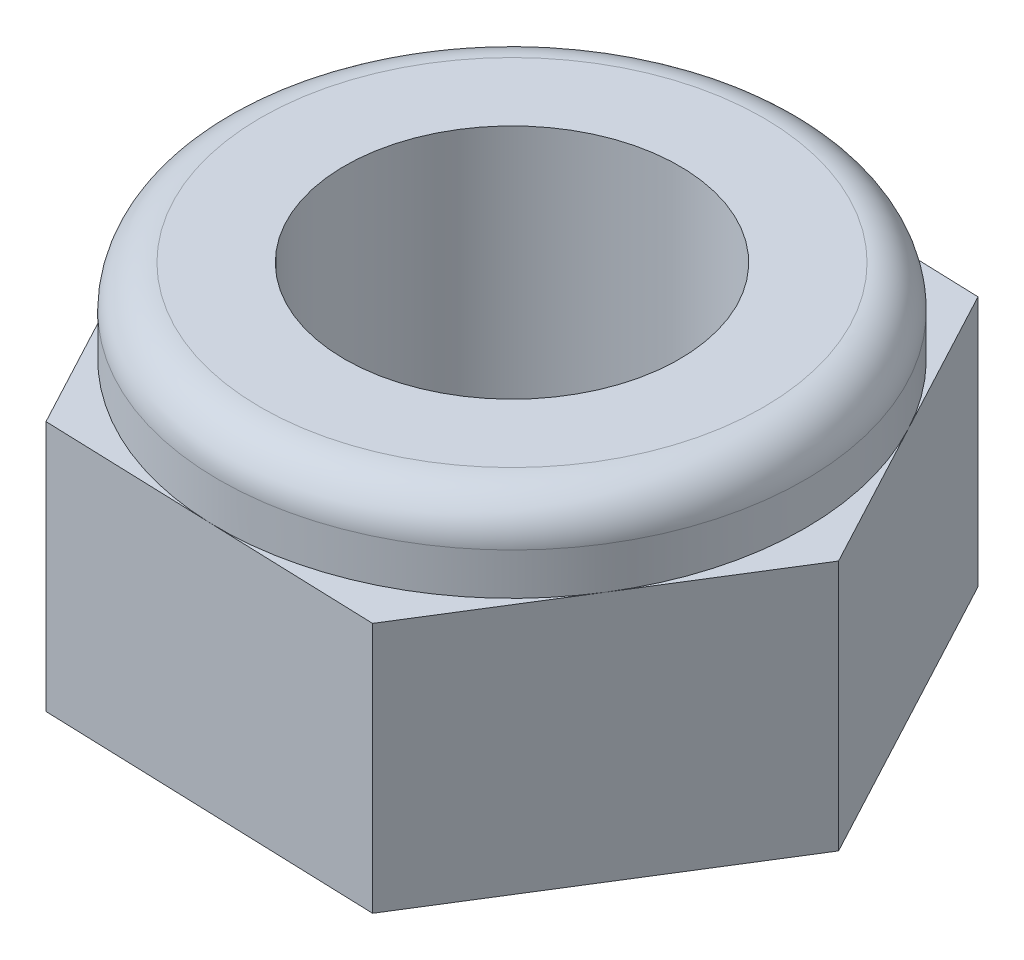
ISO-10303-21;
HEADER;
FILE_DESCRIPTION(('STEP AP214'),'2;1');
FILE_NAME('part.step','',(''),(''),'','','');
FILE_SCHEMA(('AUTOMOTIVE_DESIGN { 1 0 10303 214 1 1 1 1 }'));
ENDSEC;
DATA;
#1=APPLICATION_CONTEXT('core data for automotive mechanical design processes');
#2=APPLICATION_PROTOCOL_DEFINITION('international standard','automotive_design',2000,#1);
#3=PRODUCT_CONTEXT('',#1,'mechanical');
#4=PRODUCT('Part','Part','',(#3));
#5=PRODUCT_RELATED_PRODUCT_CATEGORY('part','',(#4));
#6=PRODUCT_DEFINITION_FORMATION('','',#4);
#7=PRODUCT_DEFINITION_CONTEXT('part definition',#1,'design');
#8=PRODUCT_DEFINITION('design','',#6,#7);
#9=PRODUCT_DEFINITION_SHAPE('','',#8);
#10=(LENGTH_UNIT() NAMED_UNIT(*) SI_UNIT(.MILLI.,.METRE.));
#11=(NAMED_UNIT(*) PLANE_ANGLE_UNIT() SI_UNIT($,.RADIAN.));
#12=(NAMED_UNIT(*) SI_UNIT($,.STERADIAN.) SOLID_ANGLE_UNIT());
#13=UNCERTAINTY_MEASURE_WITH_UNIT(LENGTH_MEASURE(1.E-05),#10,'distance_accuracy_value','');
#14=(GEOMETRIC_REPRESENTATION_CONTEXT(3) GLOBAL_UNCERTAINTY_ASSIGNED_CONTEXT((#13)) GLOBAL_UNIT_ASSIGNED_CONTEXT((#10,
#11,#12)) REPRESENTATION_CONTEXT('',''));
#15=CARTESIAN_POINT('',(0.,0.,0.));
#16=DIRECTION('',(0.,0.,1.));
#17=DIRECTION('',(1.,0.,0.));
#18=AXIS2_PLACEMENT_3D('',#15,#16,#17);
#19=CARTESIAN_POINT('',(0.,3.,0.));
#20=DIRECTION('',(0.,1.,0.));
#21=DIRECTION('',(0.,0.,1.));
#22=AXIS2_PLACEMENT_3D('',#19,#20,#21);
#23=PLANE('',#22);
#24=CARTESIAN_POINT('',(0.,3.,0.));
#25=DIRECTION('',(0.,1.,0.));
#26=DIRECTION('',(0.,0.,1.));
#27=AXIS2_PLACEMENT_3D('',#24,#25,#26);
#28=CIRCLE('',#27,3.5);
#29=CARTESIAN_POINT('',(2.96991913044493,3.,1.85191262175547));
#30=VERTEX_POINT('',#29);
#31=CARTESIAN_POINT('',(3.08876294125175,3.,-1.64606910327296));
#32=VERTEX_POINT('',#31);
#33=EDGE_CURVE('E130',#30,#32,#28,.T.);
#34=ORIENTED_EDGE('',*,*,#33,.F.);
#35=DIRECTION('',(0.529117891930135,0.,-0.848548322984266));
#36=VECTOR('',#35,1.);
#37=CARTESIAN_POINT('',(1.90071687975874,3.,3.56659623118927));
#38=LINE('',#37,#36);
#39=CARTESIAN_POINT('',(4.03912138113112,3.,0.137229012321677));
#40=VERTEX_POINT('',#39);
#41=EDGE_CURVE('E117',#30,#40,#38,.T.);
#42=ORIENTED_EDGE('',*,*,#41,.T.);
#43=DIRECTION('',(-0.470305458077989,0.,-0.882503697500499));
#44=VECTOR('',#43,1.);
#45=CARTESIAN_POINT('',(4.03912138113112,3.,0.137229012321677));
#46=LINE('',#45,#44);
#47=EDGE_CURVE('E131',#40,#32,#46,.T.);
#48=ORIENTED_EDGE('',*,*,#47,.T.);
#49=EDGE_LOOP('',(#34,#42,#48));
#50=FACE_BOUND('',#49,.T.);
#51=ADVANCED_FACE('F39',(#50),#23,.T.);
#52=CARTESIAN_POINT('',(0.118843810806818,3.,-3.49798172502844));
#53=VERTEX_POINT('',#52);
#54=EDGE_CURVE('E137',#32,#53,#28,.T.);
#55=ORIENTED_EDGE('',*,*,#54,.F.);
#56=CARTESIAN_POINT('',(2.13840450137238,3.,-3.4293672188676));
#57=VERTEX_POINT('',#56);
#58=EDGE_CURVE('E116',#32,#57,#46,.T.);
#59=ORIENTED_EDGE('',*,*,#58,.T.);
#60=DIRECTION('',(-0.999423350008125,0.,-0.0339553745162337));
#61=VECTOR('',#60,1.);
#62=CARTESIAN_POINT('',(2.13840450137238,3.,-3.4293672188676));
#63=LINE('',#62,#61);
#64=EDGE_CURVE('E149',#57,#53,#63,.T.);
#65=ORIENTED_EDGE('',*,*,#64,.T.);
#66=EDGE_LOOP('',(#55,#59,#65));
#67=FACE_BOUND('',#66,.T.);
#68=ADVANCED_FACE('F229',(#67),#23,.T.);
#69=CARTESIAN_POINT('',(-2.96991913044493,3.,-1.85191262175548));
#70=VERTEX_POINT('',#69);
#71=EDGE_CURVE('E187',#53,#70,#28,.T.);
#72=ORIENTED_EDGE('',*,*,#71,.F.);
#73=CARTESIAN_POINT('',(-1.90071687975874,3.,-3.56659623118928));
#74=VERTEX_POINT('',#73);
#75=EDGE_CURVE('E148',#53,#74,#63,.T.);
#76=ORIENTED_EDGE('',*,*,#75,.T.);
#77=DIRECTION('',(-0.529117891930136,0.,0.848548322984266));
#78=VECTOR('',#77,1.);
#79=CARTESIAN_POINT('',(-1.90071687975874,3.,-3.56659623118928));
#80=LINE('',#79,#78);
#81=EDGE_CURVE('E153',#74,#70,#80,.T.);
#82=ORIENTED_EDGE('',*,*,#81,.T.);
#83=EDGE_LOOP('',(#72,#76,#82));
#84=FACE_BOUND('',#83,.T.);
#85=ADVANCED_FACE('F198',(#84),#23,.T.);
#86=CARTESIAN_POINT('',(-3.08876294125175,3.,1.64606910327296));
#87=VERTEX_POINT('',#86);
#88=EDGE_CURVE('E140',#70,#87,#28,.T.);
#89=ORIENTED_EDGE('',*,*,#88,.F.);
#90=CARTESIAN_POINT('',(-4.03912138113112,3.,-0.137229012321677));
#91=VERTEX_POINT('',#90);
#92=EDGE_CURVE('E152',#70,#91,#80,.T.);
#93=ORIENTED_EDGE('',*,*,#92,.T.);
#94=DIRECTION('',(0.470305458077989,0.,0.882503697500499));
#95=VECTOR('',#94,1.);
#96=CARTESIAN_POINT('',(-4.03912138113112,3.,-0.137229012321677));
#97=LINE('',#96,#95);
#98=EDGE_CURVE('E157',#91,#87,#97,.T.);
#99=ORIENTED_EDGE('',*,*,#98,.T.);
#100=EDGE_LOOP('',(#89,#93,#99));
#101=FACE_BOUND('',#100,.T.);
#102=ADVANCED_FACE('F191',(#101),#23,.T.);
#103=CARTESIAN_POINT('',(-0.118843810806818,3.,3.49798172502844));
#104=VERTEX_POINT('',#103);
#105=EDGE_CURVE('E62',#87,#104,#28,.T.);
#106=ORIENTED_EDGE('',*,*,#105,.F.);
#107=CARTESIAN_POINT('',(-2.13840450137238,3.,3.4293672188676));
#108=VERTEX_POINT('',#107);
#109=EDGE_CURVE('E156',#87,#108,#97,.T.);
#110=ORIENTED_EDGE('',*,*,#109,.T.);
#111=DIRECTION('',(0.999423350008125,0.,0.0339553745162338));
#112=VECTOR('',#111,1.);
#113=CARTESIAN_POINT('',(-2.13840450137238,3.,3.4293672188676));
#114=LINE('',#113,#112);
#115=EDGE_CURVE('E160',#108,#104,#114,.T.);
#116=ORIENTED_EDGE('',*,*,#115,.T.);
#117=EDGE_LOOP('',(#106,#110,#116));
#118=FACE_BOUND('',#117,.T.);
#119=ADVANCED_FACE('F217',(#118),#23,.T.);
#120=CARTESIAN_POINT('',(1.90071687975874,3.,3.56659623118927));
#121=DIRECTION('',(-0.848548322984266,0.,-0.529117891930135));
#122=DIRECTION('',(-0.529117891930135,0.,0.848548322984266));
#123=AXIS2_PLACEMENT_3D('',#120,#121,#122);
#124=PLANE('',#123);
#125=DIRECTION('',(0.529117891930135,0.,-0.848548322984266));
#126=VECTOR('',#125,1.);
#127=CARTESIAN_POINT('',(1.90071687975874,0.,3.56659623118927));
#128=LINE('',#127,#126);
#129=CARTESIAN_POINT('',(1.90071687975874,0.,3.56659623118927));
#130=VERTEX_POINT('',#129);
#131=CARTESIAN_POINT('',(4.03912138113112,0.,0.137229012321677));
#132=VERTEX_POINT('',#131);
#133=EDGE_CURVE('E134',#130,#132,#128,.T.);
#134=ORIENTED_EDGE('',*,*,#133,.T.);
#135=DIRECTION('',(0.,-1.,0.));
#136=VECTOR('',#135,1.);
#137=CARTESIAN_POINT('',(4.03912138113112,3.,0.137229012321677));
#138=LINE('',#137,#136);
#139=EDGE_CURVE('E124',#40,#132,#138,.T.);
#140=ORIENTED_EDGE('',*,*,#139,.F.);
#141=ORIENTED_EDGE('',*,*,#41,.F.);
#142=CARTESIAN_POINT('',(1.90071687975874,3.,3.56659623118927));
#143=VERTEX_POINT('',#142);
#144=EDGE_CURVE('E109',#143,#30,#38,.T.);
#145=ORIENTED_EDGE('',*,*,#144,.F.);
#146=DIRECTION('',(0.,-1.,0.));
#147=VECTOR('',#146,1.);
#148=CARTESIAN_POINT('',(1.90071687975874,3.,3.56659623118927));
#149=LINE('',#148,#147);
#150=EDGE_CURVE('E162',#143,#130,#149,.T.);
#151=ORIENTED_EDGE('',*,*,#150,.T.);
#152=EDGE_LOOP('',(#134,#140,#141,#145,#151));
#153=FACE_BOUND('',#152,.T.);
#154=ADVANCED_FACE('F122',(#153),#124,.F.);
#155=CARTESIAN_POINT('',(4.03912138113112,3.,0.137229012321677));
#156=DIRECTION('',(-0.882503697500499,0.,0.470305458077989));
#157=DIRECTION('',(0.470305458077989,0.,0.882503697500499));
#158=AXIS2_PLACEMENT_3D('',#155,#156,#157);
#159=PLANE('',#158);
#160=DIRECTION('',(-0.470305458077989,0.,-0.882503697500499));
#161=VECTOR('',#160,1.);
#162=CARTESIAN_POINT('',(4.03912138113112,0.,0.137229012321677));
#163=LINE('',#162,#161);
#164=CARTESIAN_POINT('',(2.13840450137238,0.,-3.4293672188676));
#165=VERTEX_POINT('',#164);
#166=EDGE_CURVE('E164',#132,#165,#163,.T.);
#167=ORIENTED_EDGE('',*,*,#166,.T.);
#168=DIRECTION('',(0.,-1.,0.));
#169=VECTOR('',#168,1.);
#170=CARTESIAN_POINT('',(2.13840450137238,3.,-3.4293672188676));
#171=LINE('',#170,#169);
#172=EDGE_CURVE('E141',#57,#165,#171,.T.);
#173=ORIENTED_EDGE('',*,*,#172,.F.);
#174=ORIENTED_EDGE('',*,*,#58,.F.);
#175=ORIENTED_EDGE('',*,*,#47,.F.);
#176=ORIENTED_EDGE('',*,*,#139,.T.);
#177=EDGE_LOOP('',(#167,#173,#174,#175,#176));
#178=FACE_BOUND('',#177,.T.);
#179=ADVANCED_FACE('F224',(#178),#159,.F.);
#180=CARTESIAN_POINT('',(2.13840450137238,3.,-3.4293672188676));
#181=DIRECTION('',(-0.0339553745162337,0.,0.999423350008124));
#182=DIRECTION('',(0.999423350008125,0.,0.0339553745162337));
#183=AXIS2_PLACEMENT_3D('',#180,#181,#182);
#184=PLANE('',#183);
#185=DIRECTION('',(-0.999423350008125,0.,-0.0339553745162337));
#186=VECTOR('',#185,1.);
#187=CARTESIAN_POINT('',(2.13840450137238,0.,-3.4293672188676));
#188=LINE('',#187,#186);
#189=CARTESIAN_POINT('',(-1.90071687975874,0.,-3.56659623118928));
#190=VERTEX_POINT('',#189);
#191=EDGE_CURVE('E166',#165,#190,#188,.T.);
#192=ORIENTED_EDGE('',*,*,#191,.T.);
#193=DIRECTION('',(0.,-1.,0.));
#194=VECTOR('',#193,1.);
#195=CARTESIAN_POINT('',(-1.90071687975874,3.,-3.56659623118928));
#196=LINE('',#195,#194);
#197=EDGE_CURVE('E180',#74,#190,#196,.T.);
#198=ORIENTED_EDGE('',*,*,#197,.F.);
#199=ORIENTED_EDGE('',*,*,#75,.F.);
#200=ORIENTED_EDGE('',*,*,#64,.F.);
#201=ORIENTED_EDGE('',*,*,#172,.T.);
#202=EDGE_LOOP('',(#192,#198,#199,#200,#201));
#203=FACE_BOUND('',#202,.T.);
#204=ADVANCED_FACE('F203',(#203),#184,.F.);
#205=CARTESIAN_POINT('',(-1.90071687975874,3.,-3.56659623118928));
#206=DIRECTION('',(0.848548322984266,0.,0.529117891930135));
#207=DIRECTION('',(0.529117891930135,0.,-0.848548322984266));
#208=AXIS2_PLACEMENT_3D('',#205,#206,#207);
#209=PLANE('',#208);
#210=DIRECTION('',(-0.529117891930136,0.,0.848548322984266));
#211=VECTOR('',#210,1.);
#212=CARTESIAN_POINT('',(-1.90071687975874,0.,-3.56659623118928));
#213=LINE('',#212,#211);
#214=CARTESIAN_POINT('',(-4.03912138113112,0.,-0.137229012321677));
#215=VERTEX_POINT('',#214);
#216=EDGE_CURVE('E168',#190,#215,#213,.T.);
#217=ORIENTED_EDGE('',*,*,#216,.T.);
#218=DIRECTION('',(0.,-1.,0.));
#219=VECTOR('',#218,1.);
#220=CARTESIAN_POINT('',(-4.03912138113112,3.,-0.137229012321677));
#221=LINE('',#220,#219);
#222=EDGE_CURVE('E177',#91,#215,#221,.T.);
#223=ORIENTED_EDGE('',*,*,#222,.F.);
#224=ORIENTED_EDGE('',*,*,#92,.F.);
#225=ORIENTED_EDGE('',*,*,#81,.F.);
#226=ORIENTED_EDGE('',*,*,#197,.T.);
#227=EDGE_LOOP('',(#217,#223,#224,#225,#226));
#228=FACE_BOUND('',#227,.T.);
#229=ADVANCED_FACE('F196',(#228),#209,.F.);
#230=CARTESIAN_POINT('',(-4.03912138113112,3.,-0.137229012321677));
#231=DIRECTION('',(0.882503697500499,0.,-0.470305458077989));
#232=DIRECTION('',(-0.470305458077989,0.,-0.882503697500499));
#233=AXIS2_PLACEMENT_3D('',#230,#231,#232);
#234=PLANE('',#233);
#235=DIRECTION('',(0.470305458077989,0.,0.882503697500499));
#236=VECTOR('',#235,1.);
#237=CARTESIAN_POINT('',(-4.03912138113112,0.,-0.137229012321677));
#238=LINE('',#237,#236);
#239=CARTESIAN_POINT('',(-2.13840450137238,0.,3.4293672188676));
#240=VERTEX_POINT('',#239);
#241=EDGE_CURVE('E170',#215,#240,#238,.T.);
#242=ORIENTED_EDGE('',*,*,#241,.T.);
#243=DIRECTION('',(0.,-1.,0.));
#244=VECTOR('',#243,1.);
#245=CARTESIAN_POINT('',(-2.13840450137238,3.,3.4293672188676));
#246=LINE('',#245,#244);
#247=EDGE_CURVE('E174',#108,#240,#246,.T.);
#248=ORIENTED_EDGE('',*,*,#247,.F.);
#249=ORIENTED_EDGE('',*,*,#109,.F.);
#250=ORIENTED_EDGE('',*,*,#98,.F.);
#251=ORIENTED_EDGE('',*,*,#222,.T.);
#252=EDGE_LOOP('',(#242,#248,#249,#250,#251));
#253=FACE_BOUND('',#252,.T.);
#254=ADVANCED_FACE('F213',(#253),#234,.F.);
#255=CARTESIAN_POINT('',(-2.13840450137238,3.,3.4293672188676));
#256=DIRECTION('',(0.0339553745162338,0.,-0.999423350008124));
#257=DIRECTION('',(-0.999423350008125,0.,-0.0339553745162338));
#258=AXIS2_PLACEMENT_3D('',#255,#256,#257);
#259=PLANE('',#258);
#260=DIRECTION('',(0.999423350008125,0.,0.0339553745162338));
#261=VECTOR('',#260,1.);
#262=CARTESIAN_POINT('',(-2.13840450137238,0.,3.4293672188676));
#263=LINE('',#262,#261);
#264=EDGE_CURVE('E128',#240,#130,#263,.T.);
#265=ORIENTED_EDGE('',*,*,#264,.T.);
#266=ORIENTED_EDGE('',*,*,#150,.F.);
#267=EDGE_CURVE('E112',#104,#143,#114,.T.);
#268=ORIENTED_EDGE('',*,*,#267,.F.);
#269=ORIENTED_EDGE('',*,*,#115,.F.);
#270=ORIENTED_EDGE('',*,*,#247,.T.);
#271=EDGE_LOOP('',(#265,#266,#268,#269,#270));
#272=FACE_BOUND('',#271,.T.);
#273=ADVANCED_FACE('F216',(#272),#259,.F.);
#274=EDGE_CURVE('E54',#104,#30,#28,.T.);
#275=ORIENTED_EDGE('',*,*,#274,.F.);
#276=ORIENTED_EDGE('',*,*,#267,.T.);
#277=ORIENTED_EDGE('',*,*,#144,.T.);
#278=EDGE_LOOP('',(#275,#276,#277));
#279=FACE_BOUND('',#278,.T.);
#280=ADVANCED_FACE('F111',(#279),#23,.T.);
#281=CARTESIAN_POINT('',(0.,0.,0.));
#282=DIRECTION('',(0.,1.,0.));
#283=DIRECTION('',(0.,0.,1.));
#284=AXIS2_PLACEMENT_3D('',#281,#282,#283);
#285=PLANE('',#284);
#286=CARTESIAN_POINT('',(0.,0.,0.));
#287=DIRECTION('',(0.,1.,0.));
#288=DIRECTION('',(0.,0.,1.));
#289=AXIS2_PLACEMENT_3D('',#286,#287,#288);
#290=CIRCLE('',#289,2.);
#291=CARTESIAN_POINT('',(0.,0.,2.));
#292=VERTEX_POINT('',#291);
#293=EDGE_CURVE('E135',#292,#292,#290,.T.);
#294=ORIENTED_EDGE('',*,*,#293,.T.);
#295=EDGE_LOOP('',(#294));
#296=FACE_BOUND('',#295,.T.);
#297=ORIENTED_EDGE('',*,*,#133,.F.);
#298=ORIENTED_EDGE('',*,*,#264,.F.);
#299=ORIENTED_EDGE('',*,*,#241,.F.);
#300=ORIENTED_EDGE('',*,*,#216,.F.);
#301=ORIENTED_EDGE('',*,*,#191,.F.);
#302=ORIENTED_EDGE('',*,*,#166,.F.);
#303=EDGE_LOOP('',(#297,#298,#299,#300,#301,#302));
#304=FACE_BOUND('',#303,.T.);
#305=ADVANCED_FACE('F209',(#296,#304),#285,.F.);
#306=CARTESIAN_POINT('',(0.,4.,0.));
#307=DIRECTION('',(0.,-1.,0.));
#308=DIRECTION('',(0.,0.,-1.));
#309=AXIS2_PLACEMENT_3D('',#306,#307,#308);
#310=CYLINDRICAL_SURFACE('',#309,3.5);
#311=CARTESIAN_POINT('',(0.,3.5,0.));
#312=DIRECTION('',(0.,1.,0.));
#313=DIRECTION('',(0.,0.,1.));
#314=AXIS2_PLACEMENT_3D('',#311,#312,#313);
#315=CIRCLE('',#314,3.5);
#316=CARTESIAN_POINT('',(0.,3.5,3.5));
#317=VERTEX_POINT('',#316);
#318=EDGE_CURVE('E11',#317,#317,#315,.F.);
#319=ORIENTED_EDGE('',*,*,#318,.T.);
#320=EDGE_LOOP('',(#319));
#321=FACE_BOUND('',#320,.T.);
#322=ORIENTED_EDGE('',*,*,#33,.T.);
#323=ORIENTED_EDGE('',*,*,#54,.T.);
#324=ORIENTED_EDGE('',*,*,#71,.T.);
#325=ORIENTED_EDGE('',*,*,#88,.T.);
#326=ORIENTED_EDGE('',*,*,#105,.T.);
#327=ORIENTED_EDGE('',*,*,#274,.T.);
#328=EDGE_LOOP('',(#322,#323,#324,#325,#326,#327));
#329=FACE_BOUND('',#328,.T.);
#330=ADVANCED_FACE('F138',(#321,#329),#310,.T.);
#331=CARTESIAN_POINT('',(0.,4.,0.));
#332=DIRECTION('',(0.,1.,0.));
#333=DIRECTION('',(0.,0.,1.));
#334=AXIS2_PLACEMENT_3D('',#331,#332,#333);
#335=PLANE('',#334);
#336=CARTESIAN_POINT('',(0.,4.,0.));
#337=DIRECTION('',(0.,1.,0.));
#338=DIRECTION('',(0.,0.,1.));
#339=AXIS2_PLACEMENT_3D('',#336,#337,#338);
#340=CIRCLE('',#339,3.);
#341=CARTESIAN_POINT('',(0.,4.,3.));
#342=VERTEX_POINT('',#341);
#343=EDGE_CURVE('E47',#342,#342,#340,.T.);
#344=ORIENTED_EDGE('',*,*,#343,.T.);
#345=EDGE_LOOP('',(#344));
#346=FACE_BOUND('',#345,.T.);
#347=CARTESIAN_POINT('',(0.,4.,0.));
#348=DIRECTION('',(0.,1.,0.));
#349=DIRECTION('',(0.,0.,1.));
#350=AXIS2_PLACEMENT_3D('',#347,#348,#349);
#351=CIRCLE('',#350,2.);
#352=CARTESIAN_POINT('',(0.,4.,2.));
#353=VERTEX_POINT('',#352);
#354=EDGE_CURVE('E144',#353,#353,#351,.T.);
#355=ORIENTED_EDGE('',*,*,#354,.F.);
#356=EDGE_LOOP('',(#355));
#357=FACE_BOUND('',#356,.T.);
#358=ADVANCED_FACE('F258',(#346,#357),#335,.T.);
#359=CARTESIAN_POINT('',(0.,0.,0.));
#360=DIRECTION('',(0.,1.,0.));
#361=DIRECTION('',(0.,0.,1.));
#362=AXIS2_PLACEMENT_3D('',#359,#360,#361);
#363=CYLINDRICAL_SURFACE('',#362,2.);
#364=ORIENTED_EDGE('',*,*,#293,.F.);
#365=EDGE_LOOP('',(#364));
#366=FACE_BOUND('',#365,.T.);
#367=ORIENTED_EDGE('',*,*,#354,.T.);
#368=EDGE_LOOP('',(#367));
#369=FACE_BOUND('',#368,.T.);
#370=ADVANCED_FACE('F266',(#366,#369),#363,.F.);
#371=CARTESIAN_POINT('',(0.,3.5,0.));
#372=DIRECTION('',(0.,1.,0.));
#373=DIRECTION('',(0.,0.,1.));
#374=AXIS2_PLACEMENT_3D('',#371,#372,#373);
#375=TOROIDAL_SURFACE('',#374,3.,0.5);
#376=ORIENTED_EDGE('',*,*,#318,.F.);
#377=EDGE_LOOP('',(#376));
#378=FACE_BOUND('',#377,.T.);
#379=ORIENTED_EDGE('',*,*,#343,.F.);
#380=EDGE_LOOP('',(#379));
#381=FACE_BOUND('',#380,.T.);
#382=ADVANCED_FACE('F41',(#378,#381),#375,.T.);
#383=CLOSED_SHELL('',(#51,#68,#85,#102,#119,#154,#179,#204,#229,#254,#273,#280,#305,#330,#358,
#370,#382));
#384=MANIFOLD_SOLID_BREP('B2',#383);
#385=ADVANCED_BREP_SHAPE_REPRESENTATION('',(#18,#384),#14);
#386=SHAPE_DEFINITION_REPRESENTATION(#9,#385);
ENDSEC;
END-ISO-10303-21;
